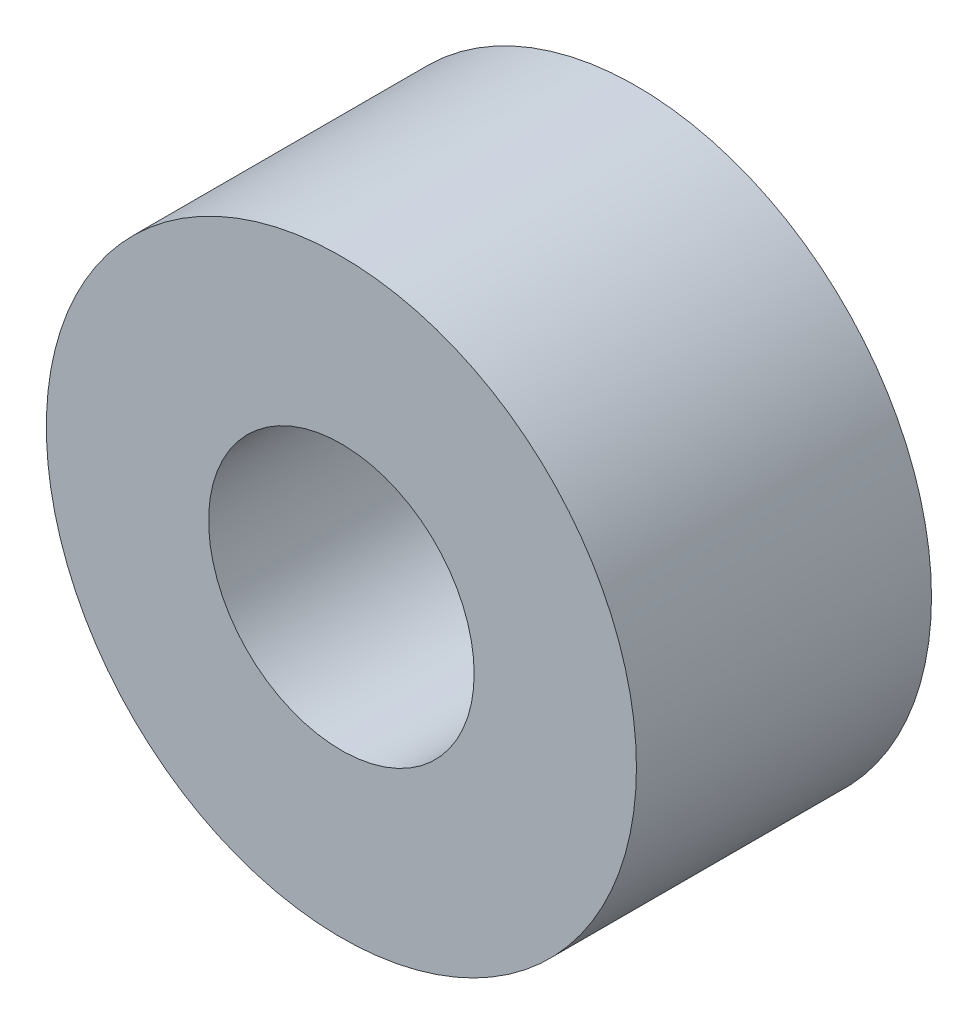
ISO-10303-21;
HEADER;
FILE_DESCRIPTION(('STEP AP214'),'2;1');
FILE_NAME('part.step','',(''),(''),'','','');
FILE_SCHEMA(('AUTOMOTIVE_DESIGN { 1 0 10303 214 1 1 1 1 }'));
ENDSEC;
DATA;
#1=APPLICATION_CONTEXT('core data for automotive mechanical design processes');
#2=APPLICATION_PROTOCOL_DEFINITION('international standard','automotive_design',2000,#1);
#3=PRODUCT_CONTEXT('',#1,'mechanical');
#4=PRODUCT('Part','Part','',(#3));
#5=PRODUCT_RELATED_PRODUCT_CATEGORY('part','',(#4));
#6=PRODUCT_DEFINITION_FORMATION('','',#4);
#7=PRODUCT_DEFINITION_CONTEXT('part definition',#1,'design');
#8=PRODUCT_DEFINITION('design','',#6,#7);
#9=PRODUCT_DEFINITION_SHAPE('','',#8);
#10=(LENGTH_UNIT() NAMED_UNIT(*) SI_UNIT(.MILLI.,.METRE.));
#11=(NAMED_UNIT(*) PLANE_ANGLE_UNIT() SI_UNIT($,.RADIAN.));
#12=(NAMED_UNIT(*) SI_UNIT($,.STERADIAN.) SOLID_ANGLE_UNIT());
#13=UNCERTAINTY_MEASURE_WITH_UNIT(LENGTH_MEASURE(1.E-05),#10,'distance_accuracy_value','');
#14=(GEOMETRIC_REPRESENTATION_CONTEXT(3) GLOBAL_UNCERTAINTY_ASSIGNED_CONTEXT((#13)) GLOBAL_UNIT_ASSIGNED_CONTEXT((#10,
#11,#12)) REPRESENTATION_CONTEXT('',''));
#15=CARTESIAN_POINT('',(0.,0.,0.));
#16=DIRECTION('',(0.,0.,1.));
#17=DIRECTION('',(1.,0.,0.));
#18=AXIS2_PLACEMENT_3D('',#15,#16,#17);
#19=CARTESIAN_POINT('',(0.,0.,5.));
#20=DIRECTION('',(0.,0.,1.));
#21=DIRECTION('',(1.,0.,0.));
#22=AXIS2_PLACEMENT_3D('',#19,#20,#21);
#23=PLANE('',#22);
#24=CARTESIAN_POINT('',(0.,0.,5.));
#25=DIRECTION('',(0.,0.,1.));
#26=DIRECTION('',(1.,0.,0.));
#27=AXIS2_PLACEMENT_3D('',#24,#25,#26);
#28=CIRCLE('',#27,5.);
#29=CARTESIAN_POINT('',(5.,0.,5.));
#30=VERTEX_POINT('',#29);
#31=EDGE_CURVE('E10',#30,#30,#28,.T.);
#32=ORIENTED_EDGE('',*,*,#31,.T.);
#33=EDGE_LOOP('',(#32));
#34=FACE_BOUND('',#33,.T.);
#35=CARTESIAN_POINT('',(0.,0.,5.));
#36=DIRECTION('',(0.,0.,1.));
#37=DIRECTION('',(1.,0.,0.));
#38=AXIS2_PLACEMENT_3D('',#35,#36,#37);
#39=CIRCLE('',#38,2.25);
#40=CARTESIAN_POINT('',(2.25,0.,5.));
#41=VERTEX_POINT('',#40);
#42=EDGE_CURVE('E56',#41,#41,#39,.T.);
#43=ORIENTED_EDGE('',*,*,#42,.F.);
#44=EDGE_LOOP('',(#43));
#45=FACE_BOUND('',#44,.T.);
#46=ADVANCED_FACE('F43',(#34,#45),#23,.T.);
#47=CARTESIAN_POINT('',(0.,0.,0.));
#48=DIRECTION('',(0.,0.,1.));
#49=DIRECTION('',(1.,0.,0.));
#50=AXIS2_PLACEMENT_3D('',#47,#48,#49);
#51=PLANE('',#50);
#52=CARTESIAN_POINT('',(0.,0.,0.));
#53=DIRECTION('',(0.,0.,1.));
#54=DIRECTION('',(1.,0.,0.));
#55=AXIS2_PLACEMENT_3D('',#52,#53,#54);
#56=CIRCLE('',#55,5.);
#57=CARTESIAN_POINT('',(5.,0.,0.));
#58=VERTEX_POINT('',#57);
#59=EDGE_CURVE('E47',#58,#58,#56,.T.);
#60=ORIENTED_EDGE('',*,*,#59,.F.);
#61=EDGE_LOOP('',(#60));
#62=FACE_BOUND('',#61,.T.);
#63=CARTESIAN_POINT('',(0.,0.,0.));
#64=DIRECTION('',(0.,0.,1.));
#65=DIRECTION('',(1.,0.,0.));
#66=AXIS2_PLACEMENT_3D('',#63,#64,#65);
#67=CIRCLE('',#66,2.25);
#68=CARTESIAN_POINT('',(2.25,0.,0.));
#69=VERTEX_POINT('',#68);
#70=EDGE_CURVE('E58',#69,#69,#67,.T.);
#71=ORIENTED_EDGE('',*,*,#70,.T.);
#72=EDGE_LOOP('',(#71));
#73=FACE_BOUND('',#72,.T.);
#74=ADVANCED_FACE('F70',(#62,#73),#51,.F.);
#75=CARTESIAN_POINT('',(0.,0.,5.));
#76=DIRECTION('',(0.,0.,-1.));
#77=DIRECTION('',(-1.,0.,0.));
#78=AXIS2_PLACEMENT_3D('',#75,#76,#77);
#79=CYLINDRICAL_SURFACE('',#78,5.);
#80=ORIENTED_EDGE('',*,*,#31,.F.);
#81=EDGE_LOOP('',(#80));
#82=FACE_BOUND('',#81,.T.);
#83=ORIENTED_EDGE('',*,*,#59,.T.);
#84=EDGE_LOOP('',(#83));
#85=FACE_BOUND('',#84,.T.);
#86=ADVANCED_FACE('F45',(#82,#85),#79,.T.);
#87=CARTESIAN_POINT('',(0.,0.,5.));
#88=DIRECTION('',(0.,0.,-1.));
#89=DIRECTION('',(-1.,0.,0.));
#90=AXIS2_PLACEMENT_3D('',#87,#88,#89);
#91=CYLINDRICAL_SURFACE('',#90,2.25);
#92=ORIENTED_EDGE('',*,*,#42,.T.);
#93=EDGE_LOOP('',(#92));
#94=FACE_BOUND('',#93,.T.);
#95=ORIENTED_EDGE('',*,*,#70,.F.);
#96=EDGE_LOOP('',(#95));
#97=FACE_BOUND('',#96,.T.);
#98=ADVANCED_FACE('F66',(#94,#97),#91,.F.);
#99=CLOSED_SHELL('',(#46,#74,#86,#98));
#100=MANIFOLD_SOLID_BREP('B2',#99);
#101=ADVANCED_BREP_SHAPE_REPRESENTATION('',(#18,#100),#14);
#102=SHAPE_DEFINITION_REPRESENTATION(#9,#101);
ENDSEC;
END-ISO-10303-21;
